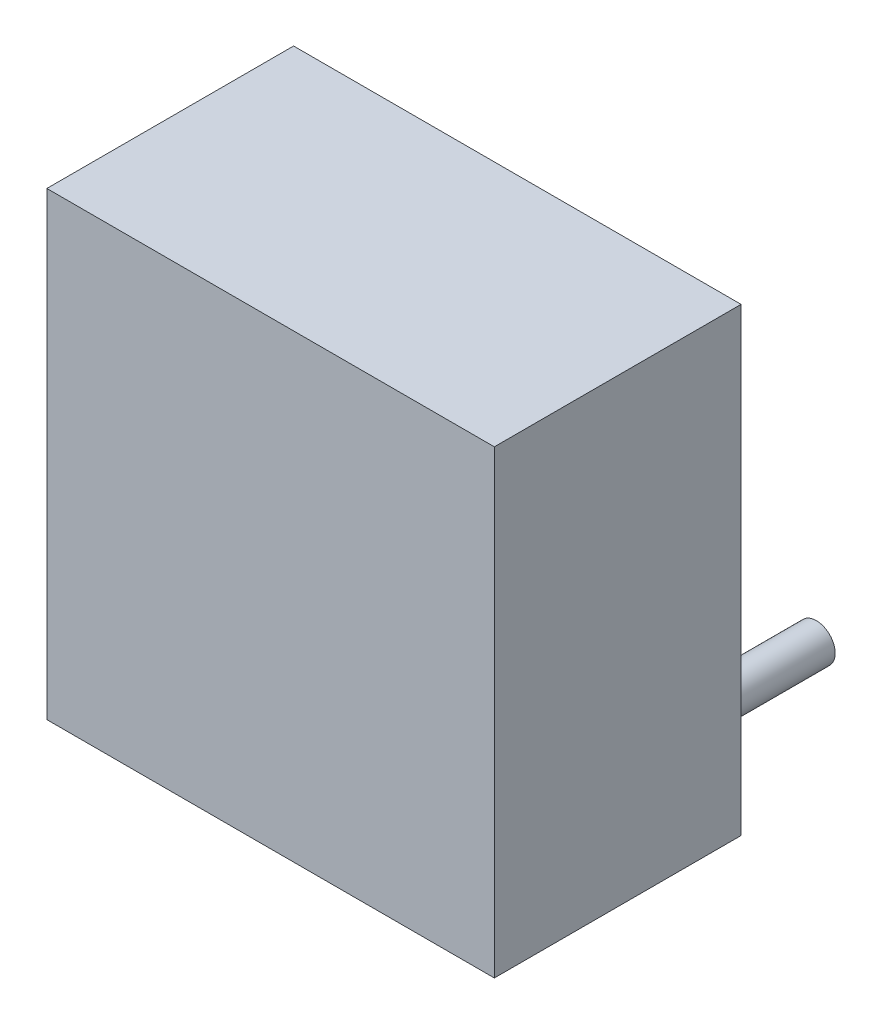
ISO-10303-21;
HEADER;
FILE_DESCRIPTION(('STEP AP214'),'2;1');
FILE_NAME('part.step','',(''),(''),'','','');
FILE_SCHEMA(('AUTOMOTIVE_DESIGN { 1 0 10303 214 1 1 1 1 }'));
ENDSEC;
DATA;
#1=APPLICATION_CONTEXT('core data for automotive mechanical design processes');
#2=APPLICATION_PROTOCOL_DEFINITION('international standard','automotive_design',2000,#1);
#3=PRODUCT_CONTEXT('',#1,'mechanical');
#4=PRODUCT('Part','Part','',(#3));
#5=PRODUCT_RELATED_PRODUCT_CATEGORY('part','',(#4));
#6=PRODUCT_DEFINITION_FORMATION('','',#4);
#7=PRODUCT_DEFINITION_CONTEXT('part definition',#1,'design');
#8=PRODUCT_DEFINITION('design','',#6,#7);
#9=PRODUCT_DEFINITION_SHAPE('','',#8);
#10=(LENGTH_UNIT() NAMED_UNIT(*) SI_UNIT(.MILLI.,.METRE.));
#11=(NAMED_UNIT(*) PLANE_ANGLE_UNIT() SI_UNIT($,.RADIAN.));
#12=(NAMED_UNIT(*) SI_UNIT($,.STERADIAN.) SOLID_ANGLE_UNIT());
#13=UNCERTAINTY_MEASURE_WITH_UNIT(LENGTH_MEASURE(1.E-05),#10,'distance_accuracy_value','');
#14=(GEOMETRIC_REPRESENTATION_CONTEXT(3) GLOBAL_UNCERTAINTY_ASSIGNED_CONTEXT((#13)) GLOBAL_UNIT_ASSIGNED_CONTEXT((#10,
#11,#12)) REPRESENTATION_CONTEXT('',''));
#15=CARTESIAN_POINT('',(0.,0.,0.));
#16=DIRECTION('',(0.,0.,1.));
#17=DIRECTION('',(1.,0.,0.));
#18=AXIS2_PLACEMENT_3D('',#15,#16,#17);
#19=CARTESIAN_POINT('',(5.35,-5.5,5.9));
#20=DIRECTION('',(-1.,0.,0.));
#21=DIRECTION('',(0.,0.,1.));
#22=AXIS2_PLACEMENT_3D('',#19,#20,#21);
#23=PLANE('',#22);
#24=DIRECTION('',(0.,1.,0.));
#25=VECTOR('',#24,1.);
#26=CARTESIAN_POINT('',(5.35,-5.5,0.));
#27=LINE('',#26,#25);
#28=CARTESIAN_POINT('',(5.35,-5.5,0.));
#29=VERTEX_POINT('',#28);
#30=CARTESIAN_POINT('',(5.35,5.5,0.));
#31=VERTEX_POINT('',#30);
#32=EDGE_CURVE('E112',#29,#31,#27,.T.);
#33=ORIENTED_EDGE('',*,*,#32,.T.);
#34=DIRECTION('',(0.,0.,-1.));
#35=VECTOR('',#34,1.);
#36=CARTESIAN_POINT('',(5.35,5.5,5.9));
#37=LINE('',#36,#35);
#38=CARTESIAN_POINT('',(5.35,5.5,5.9));
#39=VERTEX_POINT('',#38);
#40=EDGE_CURVE('E11',#39,#31,#37,.T.);
#41=ORIENTED_EDGE('',*,*,#40,.F.);
#42=DIRECTION('',(0.,1.,0.));
#43=VECTOR('',#42,1.);
#44=CARTESIAN_POINT('',(5.35,-5.5,5.9));
#45=LINE('',#44,#43);
#46=CARTESIAN_POINT('',(5.35,-5.5,5.9));
#47=VERTEX_POINT('',#46);
#48=EDGE_CURVE('E94',#47,#39,#45,.T.);
#49=ORIENTED_EDGE('',*,*,#48,.F.);
#50=DIRECTION('',(0.,0.,-1.));
#51=VECTOR('',#50,1.);
#52=CARTESIAN_POINT('',(5.35,-5.5,5.9));
#53=LINE('',#52,#51);
#54=EDGE_CURVE('E108',#47,#29,#53,.T.);
#55=ORIENTED_EDGE('',*,*,#54,.T.);
#56=EDGE_LOOP('',(#33,#41,#49,#55));
#57=FACE_BOUND('',#56,.T.);
#58=ADVANCED_FACE('F42',(#57),#23,.F.);
#59=CARTESIAN_POINT('',(-5.35,5.5,5.9));
#60=DIRECTION('',(0.,-1.,0.));
#61=DIRECTION('',(0.,0.,-1.));
#62=AXIS2_PLACEMENT_3D('',#59,#60,#61);
#63=PLANE('',#62);
#64=DIRECTION('',(-1.,0.,0.));
#65=VECTOR('',#64,1.);
#66=CARTESIAN_POINT('',(-5.35,5.5,0.));
#67=LINE('',#66,#65);
#68=CARTESIAN_POINT('',(-5.35,5.5,0.));
#69=VERTEX_POINT('',#68);
#70=EDGE_CURVE('E99',#31,#69,#67,.T.);
#71=ORIENTED_EDGE('',*,*,#70,.T.);
#72=DIRECTION('',(0.,0.,-1.));
#73=VECTOR('',#72,1.);
#74=CARTESIAN_POINT('',(-5.35,5.5,5.9));
#75=LINE('',#74,#73);
#76=CARTESIAN_POINT('',(-5.35,5.5,5.9));
#77=VERTEX_POINT('',#76);
#78=EDGE_CURVE('E51',#77,#69,#75,.T.);
#79=ORIENTED_EDGE('',*,*,#78,.F.);
#80=DIRECTION('',(-1.,0.,0.));
#81=VECTOR('',#80,1.);
#82=CARTESIAN_POINT('',(-5.35,5.5,5.9));
#83=LINE('',#82,#81);
#84=EDGE_CURVE('E89',#39,#77,#83,.T.);
#85=ORIENTED_EDGE('',*,*,#84,.F.);
#86=ORIENTED_EDGE('',*,*,#40,.T.);
#87=EDGE_LOOP('',(#71,#79,#85,#86));
#88=FACE_BOUND('',#87,.T.);
#89=ADVANCED_FACE('F98',(#88),#63,.F.);
#90=CARTESIAN_POINT('',(-5.35,-5.5,5.9));
#91=DIRECTION('',(1.,0.,0.));
#92=DIRECTION('',(0.,0.,-1.));
#93=AXIS2_PLACEMENT_3D('',#90,#91,#92);
#94=PLANE('',#93);
#95=DIRECTION('',(0.,-1.,0.));
#96=VECTOR('',#95,1.);
#97=CARTESIAN_POINT('',(-5.35,-5.5,0.));
#98=LINE('',#97,#96);
#99=CARTESIAN_POINT('',(-5.35,-5.5,0.));
#100=VERTEX_POINT('',#99);
#101=EDGE_CURVE('E76',#69,#100,#98,.T.);
#102=ORIENTED_EDGE('',*,*,#101,.T.);
#103=DIRECTION('',(0.,0.,-1.));
#104=VECTOR('',#103,1.);
#105=CARTESIAN_POINT('',(-5.35,-5.5,5.9));
#106=LINE('',#105,#104);
#107=CARTESIAN_POINT('',(-5.35,-5.5,5.9));
#108=VERTEX_POINT('',#107);
#109=EDGE_CURVE('E101',#108,#100,#106,.T.);
#110=ORIENTED_EDGE('',*,*,#109,.F.);
#111=DIRECTION('',(0.,-1.,0.));
#112=VECTOR('',#111,1.);
#113=CARTESIAN_POINT('',(-5.35,-5.5,5.9));
#114=LINE('',#113,#112);
#115=EDGE_CURVE('E92',#77,#108,#114,.T.);
#116=ORIENTED_EDGE('',*,*,#115,.F.);
#117=ORIENTED_EDGE('',*,*,#78,.T.);
#118=EDGE_LOOP('',(#102,#110,#116,#117));
#119=FACE_BOUND('',#118,.T.);
#120=ADVANCED_FACE('F102',(#119),#94,.F.);
#121=CARTESIAN_POINT('',(-5.35,-5.5,5.9));
#122=DIRECTION('',(0.,1.,0.));
#123=DIRECTION('',(0.,0.,1.));
#124=AXIS2_PLACEMENT_3D('',#121,#122,#123);
#125=PLANE('',#124);
#126=DIRECTION('',(1.,0.,0.));
#127=VECTOR('',#126,1.);
#128=CARTESIAN_POINT('',(-5.35,-5.5,0.));
#129=LINE('',#128,#127);
#130=EDGE_CURVE('E82',#100,#29,#129,.T.);
#131=ORIENTED_EDGE('',*,*,#130,.T.);
#132=ORIENTED_EDGE('',*,*,#54,.F.);
#133=DIRECTION('',(1.,0.,0.));
#134=VECTOR('',#133,1.);
#135=CARTESIAN_POINT('',(-5.35,-5.5,5.9));
#136=LINE('',#135,#134);
#137=EDGE_CURVE('E59',#108,#47,#136,.T.);
#138=ORIENTED_EDGE('',*,*,#137,.F.);
#139=ORIENTED_EDGE('',*,*,#109,.T.);
#140=EDGE_LOOP('',(#131,#132,#138,#139));
#141=FACE_BOUND('',#140,.T.);
#142=ADVANCED_FACE('F126',(#141),#125,.F.);
#143=CARTESIAN_POINT('',(0.,0.,5.9));
#144=DIRECTION('',(0.,0.,-1.));
#145=DIRECTION('',(-1.,0.,0.));
#146=AXIS2_PLACEMENT_3D('',#143,#144,#145);
#147=PLANE('',#146);
#148=ORIENTED_EDGE('',*,*,#48,.T.);
#149=ORIENTED_EDGE('',*,*,#84,.T.);
#150=ORIENTED_EDGE('',*,*,#115,.T.);
#151=ORIENTED_EDGE('',*,*,#137,.T.);
#152=EDGE_LOOP('',(#148,#149,#150,#151));
#153=FACE_BOUND('',#152,.T.);
#154=ADVANCED_FACE('F90',(#153),#147,.F.);
#155=CARTESIAN_POINT('',(0.,0.,0.));
#156=DIRECTION('',(0.,0.,-1.));
#157=DIRECTION('',(-1.,0.,0.));
#158=AXIS2_PLACEMENT_3D('',#155,#156,#157);
#159=PLANE('',#158);
#160=CARTESIAN_POINT('',(-3.75,-4.,0.));
#161=DIRECTION('',(0.,0.,-1.));
#162=DIRECTION('',(-1.,0.,0.));
#163=AXIS2_PLACEMENT_3D('',#160,#161,#162);
#164=CIRCLE('',#163,0.449999999999999);
#165=CARTESIAN_POINT('',(-4.2,-4.,0.));
#166=VERTEX_POINT('',#165);
#167=EDGE_CURVE('E152',#166,#166,#164,.T.);
#168=ORIENTED_EDGE('',*,*,#167,.F.);
#169=EDGE_LOOP('',(#168));
#170=FACE_BOUND('',#169,.T.);
#171=CARTESIAN_POINT('',(-1.25,-4.,0.));
#172=DIRECTION('',(0.,0.,-1.));
#173=DIRECTION('',(-1.,0.,0.));
#174=AXIS2_PLACEMENT_3D('',#171,#172,#173);
#175=CIRCLE('',#174,0.45);
#176=CARTESIAN_POINT('',(-1.7,-4.,0.));
#177=VERTEX_POINT('',#176);
#178=EDGE_CURVE('E145',#177,#177,#175,.T.);
#179=ORIENTED_EDGE('',*,*,#178,.F.);
#180=EDGE_LOOP('',(#179));
#181=FACE_BOUND('',#180,.T.);
#182=CARTESIAN_POINT('',(1.25,-4.,0.));
#183=DIRECTION('',(0.,0.,-1.));
#184=DIRECTION('',(-1.,0.,0.));
#185=AXIS2_PLACEMENT_3D('',#182,#183,#184);
#186=CIRCLE('',#185,0.45);
#187=CARTESIAN_POINT('',(0.799999999999999,-4.,0.));
#188=VERTEX_POINT('',#187);
#189=EDGE_CURVE('E137',#188,#188,#186,.T.);
#190=ORIENTED_EDGE('',*,*,#189,.F.);
#191=EDGE_LOOP('',(#190));
#192=FACE_BOUND('',#191,.T.);
#193=CARTESIAN_POINT('',(3.75,-4.,0.));
#194=DIRECTION('',(0.,0.,-1.));
#195=DIRECTION('',(-1.,0.,0.));
#196=AXIS2_PLACEMENT_3D('',#193,#194,#195);
#197=CIRCLE('',#196,0.45);
#198=CARTESIAN_POINT('',(3.3,-4.,0.));
#199=VERTEX_POINT('',#198);
#200=EDGE_CURVE('E134',#199,#199,#197,.T.);
#201=ORIENTED_EDGE('',*,*,#200,.F.);
#202=EDGE_LOOP('',(#201));
#203=FACE_BOUND('',#202,.T.);
#204=ORIENTED_EDGE('',*,*,#32,.F.);
#205=ORIENTED_EDGE('',*,*,#130,.F.);
#206=ORIENTED_EDGE('',*,*,#101,.F.);
#207=ORIENTED_EDGE('',*,*,#70,.F.);
#208=EDGE_LOOP('',(#204,#205,#206,#207));
#209=FACE_BOUND('',#208,.T.);
#210=ADVANCED_FACE('F129',(#170,#181,#192,#203,#209),#159,.T.);
#211=CARTESIAN_POINT('',(3.75,-4.,-3.4));
#212=DIRECTION('',(0.,0.,1.));
#213=DIRECTION('',(1.,0.,0.));
#214=AXIS2_PLACEMENT_3D('',#211,#212,#213);
#215=CYLINDRICAL_SURFACE('',#214,0.45);
#216=CARTESIAN_POINT('',(3.75,-4.,-3.4));
#217=DIRECTION('',(0.,0.,-1.));
#218=DIRECTION('',(-1.,0.,0.));
#219=AXIS2_PLACEMENT_3D('',#216,#217,#218);
#220=CIRCLE('',#219,0.45);
#221=CARTESIAN_POINT('',(3.3,-4.,-3.4));
#222=VERTEX_POINT('',#221);
#223=EDGE_CURVE('E116',#222,#222,#220,.T.);
#224=ORIENTED_EDGE('',*,*,#223,.F.);
#225=EDGE_LOOP('',(#224));
#226=FACE_BOUND('',#225,.T.);
#227=ORIENTED_EDGE('',*,*,#200,.T.);
#228=EDGE_LOOP('',(#227));
#229=FACE_BOUND('',#228,.T.);
#230=ADVANCED_FACE('F167',(#226,#229),#215,.T.);
#231=CARTESIAN_POINT('',(3.75,-4.,-3.4));
#232=DIRECTION('',(0.,0.,-1.));
#233=DIRECTION('',(-1.,0.,0.));
#234=AXIS2_PLACEMENT_3D('',#231,#232,#233);
#235=PLANE('',#234);
#236=ORIENTED_EDGE('',*,*,#223,.T.);
#237=EDGE_LOOP('',(#236));
#238=FACE_BOUND('',#237,.T.);
#239=ADVANCED_FACE('F176',(#238),#235,.T.);
#240=CARTESIAN_POINT('',(1.25,-4.,-3.4));
#241=DIRECTION('',(0.,0.,1.));
#242=DIRECTION('',(1.,0.,0.));
#243=AXIS2_PLACEMENT_3D('',#240,#241,#242);
#244=CYLINDRICAL_SURFACE('',#243,0.45);
#245=CARTESIAN_POINT('',(1.25,-4.,-3.4));
#246=DIRECTION('',(0.,0.,-1.));
#247=DIRECTION('',(-1.,0.,0.));
#248=AXIS2_PLACEMENT_3D('',#245,#246,#247);
#249=CIRCLE('',#248,0.45);
#250=CARTESIAN_POINT('',(0.799999999999999,-4.,-3.4));
#251=VERTEX_POINT('',#250);
#252=EDGE_CURVE('E141',#251,#251,#249,.T.);
#253=ORIENTED_EDGE('',*,*,#252,.F.);
#254=EDGE_LOOP('',(#253));
#255=FACE_BOUND('',#254,.T.);
#256=ORIENTED_EDGE('',*,*,#189,.T.);
#257=EDGE_LOOP('',(#256));
#258=FACE_BOUND('',#257,.T.);
#259=ADVANCED_FACE('F182',(#255,#258),#244,.T.);
#260=CARTESIAN_POINT('',(1.25,-4.,-3.4));
#261=DIRECTION('',(0.,0.,-1.));
#262=DIRECTION('',(-1.,0.,0.));
#263=AXIS2_PLACEMENT_3D('',#260,#261,#262);
#264=PLANE('',#263);
#265=ORIENTED_EDGE('',*,*,#252,.T.);
#266=EDGE_LOOP('',(#265));
#267=FACE_BOUND('',#266,.T.);
#268=ADVANCED_FACE('F220',(#267),#264,.T.);
#269=CARTESIAN_POINT('',(-1.25,-4.,-3.4));
#270=DIRECTION('',(0.,0.,1.));
#271=DIRECTION('',(1.,0.,0.));
#272=AXIS2_PLACEMENT_3D('',#269,#270,#271);
#273=CYLINDRICAL_SURFACE('',#272,0.45);
#274=CARTESIAN_POINT('',(-1.25,-4.,-3.4));
#275=DIRECTION('',(0.,0.,-1.));
#276=DIRECTION('',(-1.,0.,0.));
#277=AXIS2_PLACEMENT_3D('',#274,#275,#276);
#278=CIRCLE('',#277,0.45);
#279=CARTESIAN_POINT('',(-1.7,-4.,-3.4));
#280=VERTEX_POINT('',#279);
#281=EDGE_CURVE('E149',#280,#280,#278,.T.);
#282=ORIENTED_EDGE('',*,*,#281,.F.);
#283=EDGE_LOOP('',(#282));
#284=FACE_BOUND('',#283,.T.);
#285=ORIENTED_EDGE('',*,*,#178,.T.);
#286=EDGE_LOOP('',(#285));
#287=FACE_BOUND('',#286,.T.);
#288=ADVANCED_FACE('F229',(#284,#287),#273,.T.);
#289=CARTESIAN_POINT('',(-1.25,-4.,-3.4));
#290=DIRECTION('',(0.,0.,-1.));
#291=DIRECTION('',(-1.,0.,0.));
#292=AXIS2_PLACEMENT_3D('',#289,#290,#291);
#293=PLANE('',#292);
#294=ORIENTED_EDGE('',*,*,#281,.T.);
#295=EDGE_LOOP('',(#294));
#296=FACE_BOUND('',#295,.T.);
#297=ADVANCED_FACE('F238',(#296),#293,.T.);
#298=CARTESIAN_POINT('',(-3.75,-4.,-3.4));
#299=DIRECTION('',(0.,0.,1.));
#300=DIRECTION('',(1.,0.,0.));
#301=AXIS2_PLACEMENT_3D('',#298,#299,#300);
#302=CYLINDRICAL_SURFACE('',#301,0.449999999999999);
#303=CARTESIAN_POINT('',(-3.75,-4.,-3.4));
#304=DIRECTION('',(0.,0.,-1.));
#305=DIRECTION('',(-1.,0.,0.));
#306=AXIS2_PLACEMENT_3D('',#303,#304,#305);
#307=CIRCLE('',#306,0.449999999999999);
#308=CARTESIAN_POINT('',(-4.2,-4.,-3.4));
#309=VERTEX_POINT('',#308);
#310=EDGE_CURVE('E155',#309,#309,#307,.T.);
#311=ORIENTED_EDGE('',*,*,#310,.F.);
#312=EDGE_LOOP('',(#311));
#313=FACE_BOUND('',#312,.T.);
#314=ORIENTED_EDGE('',*,*,#167,.T.);
#315=EDGE_LOOP('',(#314));
#316=FACE_BOUND('',#315,.T.);
#317=ADVANCED_FACE('F163',(#313,#316),#302,.T.);
#318=CARTESIAN_POINT('',(-3.75,-4.,-3.4));
#319=DIRECTION('',(0.,0.,-1.));
#320=DIRECTION('',(-1.,0.,0.));
#321=AXIS2_PLACEMENT_3D('',#318,#319,#320);
#322=PLANE('',#321);
#323=ORIENTED_EDGE('',*,*,#310,.T.);
#324=EDGE_LOOP('',(#323));
#325=FACE_BOUND('',#324,.T.);
#326=ADVANCED_FACE('F255',(#325),#322,.T.);
#327=CLOSED_SHELL('',(#58,#89,#120,#142,#154,#210,#230,#239,#259,#268,#288,#297,#317,#326));
#328=MANIFOLD_SOLID_BREP('B2',#327);
#329=ADVANCED_BREP_SHAPE_REPRESENTATION('',(#18,#328),#14);
#330=SHAPE_DEFINITION_REPRESENTATION(#9,#329);
ENDSEC;
END-ISO-10303-21;
